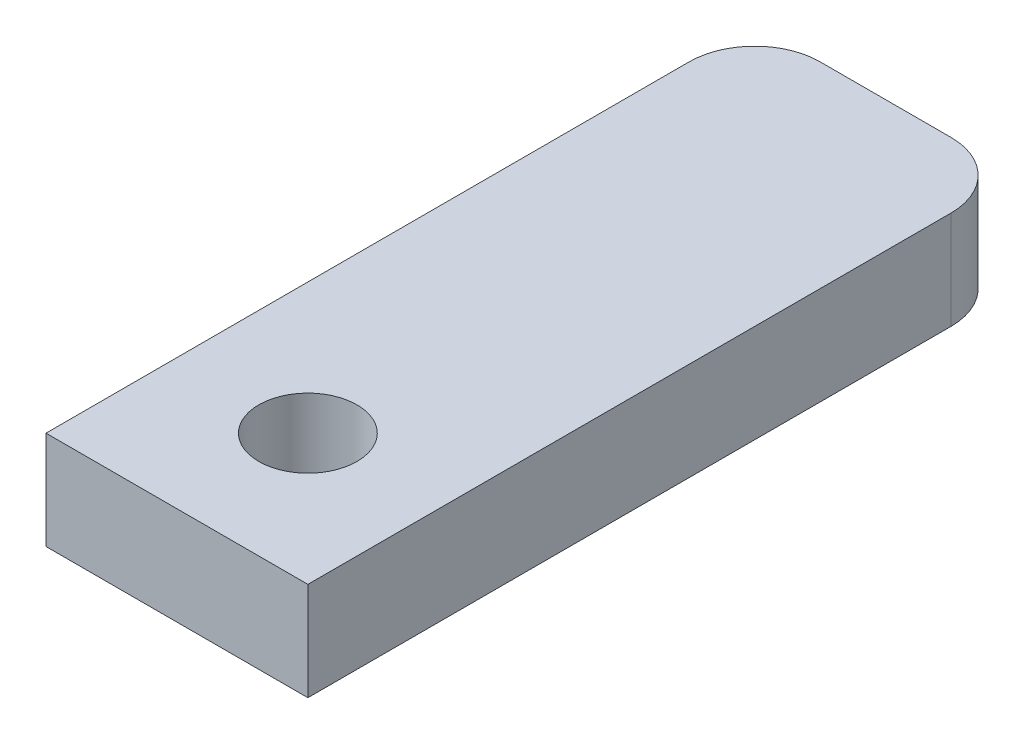
ISO-10303-21;
HEADER;
FILE_DESCRIPTION(('STEP AP214'),'2;1');
FILE_NAME('part.step','',(''),(''),'','','');
FILE_SCHEMA(('AUTOMOTIVE_DESIGN { 1 0 10303 214 1 1 1 1 }'));
ENDSEC;
DATA;
#1=APPLICATION_CONTEXT('core data for automotive mechanical design processes');
#2=APPLICATION_PROTOCOL_DEFINITION('international standard','automotive_design',2000,#1);
#3=PRODUCT_CONTEXT('',#1,'mechanical');
#4=PRODUCT('Part','Part','',(#3));
#5=PRODUCT_RELATED_PRODUCT_CATEGORY('part','',(#4));
#6=PRODUCT_DEFINITION_FORMATION('','',#4);
#7=PRODUCT_DEFINITION_CONTEXT('part definition',#1,'design');
#8=PRODUCT_DEFINITION('design','',#6,#7);
#9=PRODUCT_DEFINITION_SHAPE('','',#8);
#10=(LENGTH_UNIT() NAMED_UNIT(*) SI_UNIT(.MILLI.,.METRE.));
#11=(NAMED_UNIT(*) PLANE_ANGLE_UNIT() SI_UNIT($,.RADIAN.));
#12=(NAMED_UNIT(*) SI_UNIT($,.STERADIAN.) SOLID_ANGLE_UNIT());
#13=UNCERTAINTY_MEASURE_WITH_UNIT(LENGTH_MEASURE(1.E-05),#10,'distance_accuracy_value','');
#14=(GEOMETRIC_REPRESENTATION_CONTEXT(3) GLOBAL_UNCERTAINTY_ASSIGNED_CONTEXT((#13)) GLOBAL_UNIT_ASSIGNED_CONTEXT((#10,
#11,#12)) REPRESENTATION_CONTEXT('',''));
#15=CARTESIAN_POINT('',(0.,0.,0.));
#16=DIRECTION('',(0.,0.,1.));
#17=DIRECTION('',(1.,0.,0.));
#18=AXIS2_PLACEMENT_3D('',#15,#16,#17);
#19=CARTESIAN_POINT('',(2.,3.,-8.82391385399841));
#20=DIRECTION('',(0.,1.,0.));
#21=DIRECTION('',(0.,0.,1.));
#22=AXIS2_PLACEMENT_3D('',#19,#20,#21);
#23=PLANE('',#22);
#24=DIRECTION('',(0.,0.,-1.));
#25=VECTOR('',#24,1.);
#26=CARTESIAN_POINT('',(4.,3.,10.8239138539984));
#27=LINE('',#26,#25);
#28=CARTESIAN_POINT('',(4.,3.,10.8239138539984));
#29=VERTEX_POINT('',#28);
#30=CARTESIAN_POINT('',(4.,3.,-8.8239138539984));
#31=VERTEX_POINT('',#30);
#32=EDGE_CURVE('E133',#29,#31,#27,.T.);
#33=ORIENTED_EDGE('',*,*,#32,.T.);
#34=CARTESIAN_POINT('',(2.,3.,-8.82391385399841));
#35=DIRECTION('',(0.,1.,0.));
#36=DIRECTION('',(0.,0.,1.));
#37=AXIS2_PLACEMENT_3D('',#34,#35,#36);
#38=CIRCLE('',#37,2.);
#39=CARTESIAN_POINT('',(1.99999999999999,3.,-10.8239138539984));
#40=VERTEX_POINT('',#39);
#41=EDGE_CURVE('E91',#31,#40,#38,.T.);
#42=ORIENTED_EDGE('',*,*,#41,.T.);
#43=DIRECTION('',(-1.,0.,0.));
#44=VECTOR('',#43,1.);
#45=CARTESIAN_POINT('',(1.99999999999999,3.,-10.8239138539984));
#46=LINE('',#45,#44);
#47=CARTESIAN_POINT('',(-1.99999999999999,3.,-10.8239138539984));
#48=VERTEX_POINT('',#47);
#49=EDGE_CURVE('E104',#40,#48,#46,.T.);
#50=ORIENTED_EDGE('',*,*,#49,.T.);
#51=CARTESIAN_POINT('',(-2.,3.,-8.82391385399841));
#52=DIRECTION('',(0.,1.,0.));
#53=DIRECTION('',(0.,0.,1.));
#54=AXIS2_PLACEMENT_3D('',#51,#52,#53);
#55=CIRCLE('',#54,2.);
#56=CARTESIAN_POINT('',(-4.,3.,-8.8239138539984));
#57=VERTEX_POINT('',#56);
#58=EDGE_CURVE('E98',#48,#57,#55,.T.);
#59=ORIENTED_EDGE('',*,*,#58,.T.);
#60=DIRECTION('',(0.,0.,1.));
#61=VECTOR('',#60,1.);
#62=CARTESIAN_POINT('',(-4.,3.,10.8239138539984));
#63=LINE('',#62,#61);
#64=CARTESIAN_POINT('',(-4.,3.,10.8239138539984));
#65=VERTEX_POINT('',#64);
#66=EDGE_CURVE('E102',#57,#65,#63,.T.);
#67=ORIENTED_EDGE('',*,*,#66,.T.);
#68=DIRECTION('',(1.,0.,0.));
#69=VECTOR('',#68,1.);
#70=CARTESIAN_POINT('',(4.,3.,10.8239138539984));
#71=LINE('',#70,#69);
#72=EDGE_CURVE('E54',#65,#29,#71,.T.);
#73=ORIENTED_EDGE('',*,*,#72,.T.);
#74=EDGE_LOOP('',(#33,#42,#50,#59,#67,#73));
#75=FACE_BOUND('',#74,.T.);
#76=CARTESIAN_POINT('',(0.,3.,6.82391385399841));
#77=DIRECTION('',(0.,1.,0.));
#78=DIRECTION('',(0.,0.,1.));
#79=AXIS2_PLACEMENT_3D('',#76,#77,#78);
#80=CIRCLE('',#79,1.5);
#81=CARTESIAN_POINT('',(0.,3.,8.32391385399841));
#82=VERTEX_POINT('',#81);
#83=EDGE_CURVE('E126',#82,#82,#80,.T.);
#84=ORIENTED_EDGE('',*,*,#83,.F.);
#85=EDGE_LOOP('',(#84));
#86=FACE_BOUND('',#85,.T.);
#87=ADVANCED_FACE('F37',(#75,#86),#23,.T.);
#88=CARTESIAN_POINT('',(2.,0.,-8.82391385399841));
#89=DIRECTION('',(0.,1.,0.));
#90=DIRECTION('',(0.,0.,1.));
#91=AXIS2_PLACEMENT_3D('',#88,#89,#90);
#92=PLANE('',#91);
#93=DIRECTION('',(0.,0.,-1.));
#94=VECTOR('',#93,1.);
#95=CARTESIAN_POINT('',(4.,0.,10.8239138539984));
#96=LINE('',#95,#94);
#97=CARTESIAN_POINT('',(4.,0.,10.8239138539984));
#98=VERTEX_POINT('',#97);
#99=CARTESIAN_POINT('',(4.,0.,-8.8239138539984));
#100=VERTEX_POINT('',#99);
#101=EDGE_CURVE('E122',#98,#100,#96,.T.);
#102=ORIENTED_EDGE('',*,*,#101,.F.);
#103=DIRECTION('',(1.,0.,0.));
#104=VECTOR('',#103,1.);
#105=CARTESIAN_POINT('',(4.,0.,10.8239138539984));
#106=LINE('',#105,#104);
#107=CARTESIAN_POINT('',(-4.,0.,10.8239138539984));
#108=VERTEX_POINT('',#107);
#109=EDGE_CURVE('E83',#108,#98,#106,.T.);
#110=ORIENTED_EDGE('',*,*,#109,.F.);
#111=DIRECTION('',(0.,0.,1.));
#112=VECTOR('',#111,1.);
#113=CARTESIAN_POINT('',(-4.,0.,10.8239138539984));
#114=LINE('',#113,#112);
#115=CARTESIAN_POINT('',(-4.,0.,-8.8239138539984));
#116=VERTEX_POINT('',#115);
#117=EDGE_CURVE('E77',#116,#108,#114,.T.);
#118=ORIENTED_EDGE('',*,*,#117,.F.);
#119=CARTESIAN_POINT('',(-2.,0.,-8.82391385399841));
#120=DIRECTION('',(0.,1.,0.));
#121=DIRECTION('',(0.,0.,1.));
#122=AXIS2_PLACEMENT_3D('',#119,#120,#121);
#123=CIRCLE('',#122,2.);
#124=CARTESIAN_POINT('',(-1.99999999999999,0.,-10.8239138539984));
#125=VERTEX_POINT('',#124);
#126=EDGE_CURVE('E112',#125,#116,#123,.T.);
#127=ORIENTED_EDGE('',*,*,#126,.F.);
#128=DIRECTION('',(-1.,0.,0.));
#129=VECTOR('',#128,1.);
#130=CARTESIAN_POINT('',(1.99999999999999,0.,-10.8239138539984));
#131=LINE('',#130,#129);
#132=CARTESIAN_POINT('',(1.99999999999999,0.,-10.8239138539984));
#133=VERTEX_POINT('',#132);
#134=EDGE_CURVE('E128',#133,#125,#131,.T.);
#135=ORIENTED_EDGE('',*,*,#134,.F.);
#136=CARTESIAN_POINT('',(2.,0.,-8.82391385399841));
#137=DIRECTION('',(0.,1.,0.));
#138=DIRECTION('',(0.,0.,1.));
#139=AXIS2_PLACEMENT_3D('',#136,#137,#138);
#140=CIRCLE('',#139,2.);
#141=EDGE_CURVE('E125',#100,#133,#140,.T.);
#142=ORIENTED_EDGE('',*,*,#141,.F.);
#143=EDGE_LOOP('',(#102,#110,#118,#127,#135,#142));
#144=FACE_BOUND('',#143,.T.);
#145=CARTESIAN_POINT('',(0.,0.,6.82391385399841));
#146=DIRECTION('',(0.,1.,0.));
#147=DIRECTION('',(0.,0.,1.));
#148=AXIS2_PLACEMENT_3D('',#145,#146,#147);
#149=CIRCLE('',#148,1.5);
#150=CARTESIAN_POINT('',(0.,0.,8.32391385399841));
#151=VERTEX_POINT('',#150);
#152=EDGE_CURVE('E244',#151,#151,#149,.T.);
#153=ORIENTED_EDGE('',*,*,#152,.T.);
#154=EDGE_LOOP('',(#153));
#155=FACE_BOUND('',#154,.T.);
#156=ADVANCED_FACE('F142',(#144,#155),#92,.F.);
#157=CARTESIAN_POINT('',(4.,3.,10.8239138539984));
#158=DIRECTION('',(-1.,0.,0.));
#159=DIRECTION('',(0.,0.,1.));
#160=AXIS2_PLACEMENT_3D('',#157,#158,#159);
#161=PLANE('',#160);
#162=ORIENTED_EDGE('',*,*,#101,.T.);
#163=DIRECTION('',(0.,-1.,0.));
#164=VECTOR('',#163,1.);
#165=CARTESIAN_POINT('',(4.,3.,-8.8239138539984));
#166=LINE('',#165,#164);
#167=EDGE_CURVE('E11',#31,#100,#166,.T.);
#168=ORIENTED_EDGE('',*,*,#167,.F.);
#169=ORIENTED_EDGE('',*,*,#32,.F.);
#170=DIRECTION('',(0.,-1.,0.));
#171=VECTOR('',#170,1.);
#172=CARTESIAN_POINT('',(4.,3.,10.8239138539984));
#173=LINE('',#172,#171);
#174=EDGE_CURVE('E118',#29,#98,#173,.T.);
#175=ORIENTED_EDGE('',*,*,#174,.T.);
#176=EDGE_LOOP('',(#162,#168,#169,#175));
#177=FACE_BOUND('',#176,.T.);
#178=ADVANCED_FACE('F39',(#177),#161,.F.);
#179=CARTESIAN_POINT('',(2.,3.,-8.82391385399841));
#180=DIRECTION('',(0.,-1.,0.));
#181=DIRECTION('',(0.,0.,-1.));
#182=AXIS2_PLACEMENT_3D('',#179,#180,#181);
#183=CYLINDRICAL_SURFACE('',#182,2.);
#184=ORIENTED_EDGE('',*,*,#141,.T.);
#185=DIRECTION('',(0.,-1.,0.));
#186=VECTOR('',#185,1.);
#187=CARTESIAN_POINT('',(1.99999999999999,3.,-10.8239138539984));
#188=LINE('',#187,#186);
#189=EDGE_CURVE('E46',#40,#133,#188,.T.);
#190=ORIENTED_EDGE('',*,*,#189,.F.);
#191=ORIENTED_EDGE('',*,*,#41,.F.);
#192=ORIENTED_EDGE('',*,*,#167,.T.);
#193=EDGE_LOOP('',(#184,#190,#191,#192));
#194=FACE_BOUND('',#193,.T.);
#195=ADVANCED_FACE('F167',(#194),#183,.T.);
#196=CARTESIAN_POINT('',(1.99999999999999,3.,-10.8239138539984));
#197=DIRECTION('',(0.,0.,1.));
#198=DIRECTION('',(1.,0.,0.));
#199=AXIS2_PLACEMENT_3D('',#196,#197,#198);
#200=PLANE('',#199);
#201=ORIENTED_EDGE('',*,*,#134,.T.);
#202=DIRECTION('',(0.,-1.,0.));
#203=VECTOR('',#202,1.);
#204=CARTESIAN_POINT('',(-1.99999999999999,3.,-10.8239138539984));
#205=LINE('',#204,#203);
#206=EDGE_CURVE('E113',#48,#125,#205,.T.);
#207=ORIENTED_EDGE('',*,*,#206,.F.);
#208=ORIENTED_EDGE('',*,*,#49,.F.);
#209=ORIENTED_EDGE('',*,*,#189,.T.);
#210=EDGE_LOOP('',(#201,#207,#208,#209));
#211=FACE_BOUND('',#210,.T.);
#212=ADVANCED_FACE('F139',(#211),#200,.F.);
#213=CARTESIAN_POINT('',(-2.,3.,-8.82391385399841));
#214=DIRECTION('',(0.,-1.,0.));
#215=DIRECTION('',(0.,0.,-1.));
#216=AXIS2_PLACEMENT_3D('',#213,#214,#215);
#217=CYLINDRICAL_SURFACE('',#216,2.);
#218=ORIENTED_EDGE('',*,*,#126,.T.);
#219=DIRECTION('',(0.,-1.,0.));
#220=VECTOR('',#219,1.);
#221=CARTESIAN_POINT('',(-4.,3.,-8.8239138539984));
#222=LINE('',#221,#220);
#223=EDGE_CURVE('E109',#57,#116,#222,.T.);
#224=ORIENTED_EDGE('',*,*,#223,.F.);
#225=ORIENTED_EDGE('',*,*,#58,.F.);
#226=ORIENTED_EDGE('',*,*,#206,.T.);
#227=EDGE_LOOP('',(#218,#224,#225,#226));
#228=FACE_BOUND('',#227,.T.);
#229=ADVANCED_FACE('F110',(#228),#217,.T.);
#230=CARTESIAN_POINT('',(-4.,3.,10.8239138539984));
#231=DIRECTION('',(1.,0.,0.));
#232=DIRECTION('',(0.,0.,-1.));
#233=AXIS2_PLACEMENT_3D('',#230,#231,#232);
#234=PLANE('',#233);
#235=ORIENTED_EDGE('',*,*,#117,.T.);
#236=DIRECTION('',(0.,-1.,0.));
#237=VECTOR('',#236,1.);
#238=CARTESIAN_POINT('',(-4.,3.,10.8239138539984));
#239=LINE('',#238,#237);
#240=EDGE_CURVE('E114',#65,#108,#239,.T.);
#241=ORIENTED_EDGE('',*,*,#240,.F.);
#242=ORIENTED_EDGE('',*,*,#66,.F.);
#243=ORIENTED_EDGE('',*,*,#223,.T.);
#244=EDGE_LOOP('',(#235,#241,#242,#243));
#245=FACE_BOUND('',#244,.T.);
#246=ADVANCED_FACE('F116',(#245),#234,.F.);
#247=CARTESIAN_POINT('',(4.,3.,10.8239138539984));
#248=DIRECTION('',(0.,0.,-1.));
#249=DIRECTION('',(-1.,0.,0.));
#250=AXIS2_PLACEMENT_3D('',#247,#248,#249);
#251=PLANE('',#250);
#252=ORIENTED_EDGE('',*,*,#109,.T.);
#253=ORIENTED_EDGE('',*,*,#174,.F.);
#254=ORIENTED_EDGE('',*,*,#72,.F.);
#255=ORIENTED_EDGE('',*,*,#240,.T.);
#256=EDGE_LOOP('',(#252,#253,#254,#255));
#257=FACE_BOUND('',#256,.T.);
#258=ADVANCED_FACE('F147',(#257),#251,.F.);
#259=CARTESIAN_POINT('',(0.,3.,6.82391385399841));
#260=DIRECTION('',(0.,-1.,0.));
#261=DIRECTION('',(0.,0.,-1.));
#262=AXIS2_PLACEMENT_3D('',#259,#260,#261);
#263=CYLINDRICAL_SURFACE('',#262,1.5);
#264=ORIENTED_EDGE('',*,*,#83,.T.);
#265=EDGE_LOOP('',(#264));
#266=FACE_BOUND('',#265,.T.);
#267=ORIENTED_EDGE('',*,*,#152,.F.);
#268=EDGE_LOOP('',(#267));
#269=FACE_BOUND('',#268,.T.);
#270=ADVANCED_FACE('F149',(#266,#269),#263,.F.);
#271=CLOSED_SHELL('',(#87,#156,#178,#195,#212,#229,#246,#258,#270));
#272=MANIFOLD_SOLID_BREP('B2',#271);
#273=ADVANCED_BREP_SHAPE_REPRESENTATION('',(#18,#272),#14);
#274=SHAPE_DEFINITION_REPRESENTATION(#9,#273);
ENDSEC;
END-ISO-10303-21;
